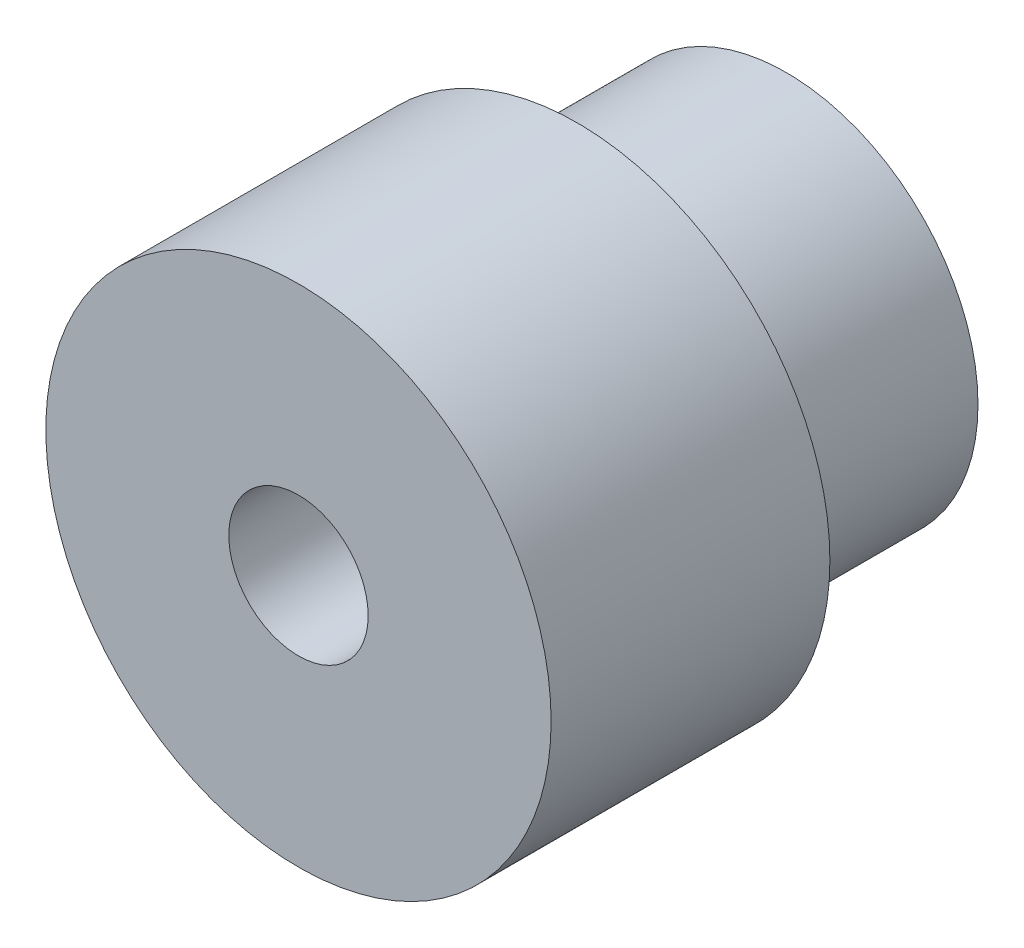
ISO-10303-21;
HEADER;
FILE_DESCRIPTION(('STEP AP214'),'2;1');
FILE_NAME('part.step','',(''),(''),'','','');
FILE_SCHEMA(('AUTOMOTIVE_DESIGN { 1 0 10303 214 1 1 1 1 }'));
ENDSEC;
DATA;
#1=APPLICATION_CONTEXT('core data for automotive mechanical design processes');
#2=APPLICATION_PROTOCOL_DEFINITION('international standard','automotive_design',2000,#1);
#3=PRODUCT_CONTEXT('',#1,'mechanical');
#4=PRODUCT('Part','Part','',(#3));
#5=PRODUCT_RELATED_PRODUCT_CATEGORY('part','',(#4));
#6=PRODUCT_DEFINITION_FORMATION('','',#4);
#7=PRODUCT_DEFINITION_CONTEXT('part definition',#1,'design');
#8=PRODUCT_DEFINITION('design','',#6,#7);
#9=PRODUCT_DEFINITION_SHAPE('','',#8);
#10=(LENGTH_UNIT() NAMED_UNIT(*) SI_UNIT(.MILLI.,.METRE.));
#11=(NAMED_UNIT(*) PLANE_ANGLE_UNIT() SI_UNIT($,.RADIAN.));
#12=(NAMED_UNIT(*) SI_UNIT($,.STERADIAN.) SOLID_ANGLE_UNIT());
#13=UNCERTAINTY_MEASURE_WITH_UNIT(LENGTH_MEASURE(1.E-05),#10,'distance_accuracy_value','');
#14=(GEOMETRIC_REPRESENTATION_CONTEXT(3) GLOBAL_UNCERTAINTY_ASSIGNED_CONTEXT((#13)) GLOBAL_UNIT_ASSIGNED_CONTEXT((#10,
#11,#12)) REPRESENTATION_CONTEXT('',''));
#15=CARTESIAN_POINT('',(0.,0.,0.));
#16=DIRECTION('',(0.,0.,1.));
#17=DIRECTION('',(1.,0.,0.));
#18=AXIS2_PLACEMENT_3D('',#15,#16,#17);
#19=CARTESIAN_POINT('',(0.,0.,16.));
#20=DIRECTION('',(0.,0.,-1.));
#21=DIRECTION('',(-1.,0.,0.));
#22=AXIS2_PLACEMENT_3D('',#19,#20,#21);
#23=CYLINDRICAL_SURFACE('',#22,14.5);
#24=CARTESIAN_POINT('',(0.,0.,16.));
#25=DIRECTION('',(0.,0.,1.));
#26=DIRECTION('',(1.,0.,0.));
#27=AXIS2_PLACEMENT_3D('',#24,#25,#26);
#28=CIRCLE('',#27,14.5);
#29=CARTESIAN_POINT('',(14.5,0.,16.));
#30=VERTEX_POINT('',#29);
#31=EDGE_CURVE('E10',#30,#30,#28,.T.);
#32=ORIENTED_EDGE('',*,*,#31,.F.);
#33=EDGE_LOOP('',(#32));
#34=FACE_BOUND('',#33,.T.);
#35=CARTESIAN_POINT('',(0.,0.,0.));
#36=DIRECTION('',(0.,0.,1.));
#37=DIRECTION('',(1.,0.,0.));
#38=AXIS2_PLACEMENT_3D('',#35,#36,#37);
#39=CIRCLE('',#38,14.5);
#40=CARTESIAN_POINT('',(14.5,0.,0.));
#41=VERTEX_POINT('',#40);
#42=EDGE_CURVE('E33',#41,#41,#39,.T.);
#43=ORIENTED_EDGE('',*,*,#42,.T.);
#44=EDGE_LOOP('',(#43));
#45=FACE_BOUND('',#44,.T.);
#46=ADVANCED_FACE('F30',(#34,#45),#23,.T.);
#47=CARTESIAN_POINT('',(0.,0.,16.));
#48=DIRECTION('',(0.,0.,1.));
#49=DIRECTION('',(1.,0.,0.));
#50=AXIS2_PLACEMENT_3D('',#47,#48,#49);
#51=PLANE('',#50);
#52=CARTESIAN_POINT('',(0.,0.,16.));
#53=DIRECTION('',(0.,0.,1.));
#54=DIRECTION('',(1.,0.,0.));
#55=AXIS2_PLACEMENT_3D('',#52,#53,#54);
#56=CIRCLE('',#55,4.);
#57=CARTESIAN_POINT('',(4.,0.,16.));
#58=VERTEX_POINT('',#57);
#59=EDGE_CURVE('E50',#58,#58,#56,.T.);
#60=ORIENTED_EDGE('',*,*,#59,.F.);
#61=EDGE_LOOP('',(#60));
#62=FACE_BOUND('',#61,.T.);
#63=ORIENTED_EDGE('',*,*,#31,.T.);
#64=EDGE_LOOP('',(#63));
#65=FACE_BOUND('',#64,.T.);
#66=ADVANCED_FACE('F56',(#62,#65),#51,.T.);
#67=CARTESIAN_POINT('',(0.,0.,0.));
#68=DIRECTION('',(0.,0.,1.));
#69=DIRECTION('',(1.,0.,0.));
#70=AXIS2_PLACEMENT_3D('',#67,#68,#69);
#71=PLANE('',#70);
#72=CARTESIAN_POINT('',(0.,0.,0.));
#73=DIRECTION('',(0.,0.,1.));
#74=DIRECTION('',(1.,0.,0.));
#75=AXIS2_PLACEMENT_3D('',#72,#73,#74);
#76=CIRCLE('',#75,11.);
#77=CARTESIAN_POINT('',(11.,0.,0.));
#78=VERTEX_POINT('',#77);
#79=EDGE_CURVE('E42',#78,#78,#76,.T.);
#80=ORIENTED_EDGE('',*,*,#79,.T.);
#81=EDGE_LOOP('',(#80));
#82=FACE_BOUND('',#81,.T.);
#83=ORIENTED_EDGE('',*,*,#42,.F.);
#84=EDGE_LOOP('',(#83));
#85=FACE_BOUND('',#84,.T.);
#86=ADVANCED_FACE('F58',(#82,#85),#71,.F.);
#87=CARTESIAN_POINT('',(0.,0.,-12.));
#88=DIRECTION('',(0.,0.,1.));
#89=DIRECTION('',(1.,0.,0.));
#90=AXIS2_PLACEMENT_3D('',#87,#88,#89);
#91=CYLINDRICAL_SURFACE('',#90,11.);
#92=CARTESIAN_POINT('',(0.,0.,-12.));
#93=DIRECTION('',(0.,0.,1.));
#94=DIRECTION('',(1.,0.,0.));
#95=AXIS2_PLACEMENT_3D('',#92,#93,#94);
#96=CIRCLE('',#95,11.);
#97=CARTESIAN_POINT('',(11.,0.,-12.));
#98=VERTEX_POINT('',#97);
#99=EDGE_CURVE('E40',#98,#98,#96,.T.);
#100=ORIENTED_EDGE('',*,*,#99,.T.);
#101=EDGE_LOOP('',(#100));
#102=FACE_BOUND('',#101,.T.);
#103=ORIENTED_EDGE('',*,*,#79,.F.);
#104=EDGE_LOOP('',(#103));
#105=FACE_BOUND('',#104,.T.);
#106=ADVANCED_FACE('F64',(#102,#105),#91,.T.);
#107=CARTESIAN_POINT('',(0.,0.,-12.));
#108=DIRECTION('',(0.,0.,1.));
#109=DIRECTION('',(1.,0.,0.));
#110=AXIS2_PLACEMENT_3D('',#107,#108,#109);
#111=PLANE('',#110);
#112=CARTESIAN_POINT('',(0.,0.,-12.));
#113=DIRECTION('',(0.,0.,1.));
#114=DIRECTION('',(1.,0.,0.));
#115=AXIS2_PLACEMENT_3D('',#112,#113,#114);
#116=CIRCLE('',#115,4.);
#117=CARTESIAN_POINT('',(4.,0.,-12.));
#118=VERTEX_POINT('',#117);
#119=EDGE_CURVE('E45',#118,#118,#116,.T.);
#120=ORIENTED_EDGE('',*,*,#119,.T.);
#121=EDGE_LOOP('',(#120));
#122=FACE_BOUND('',#121,.T.);
#123=ORIENTED_EDGE('',*,*,#99,.F.);
#124=EDGE_LOOP('',(#123));
#125=FACE_BOUND('',#124,.T.);
#126=ADVANCED_FACE('F70',(#122,#125),#111,.F.);
#127=CARTESIAN_POINT('',(0.,0.,-12.));
#128=DIRECTION('',(0.,0.,1.));
#129=DIRECTION('',(1.,0.,0.));
#130=AXIS2_PLACEMENT_3D('',#127,#128,#129);
#131=CYLINDRICAL_SURFACE('',#130,4.);
#132=ORIENTED_EDGE('',*,*,#119,.F.);
#133=EDGE_LOOP('',(#132));
#134=FACE_BOUND('',#133,.T.);
#135=ORIENTED_EDGE('',*,*,#59,.T.);
#136=EDGE_LOOP('',(#135));
#137=FACE_BOUND('',#136,.T.);
#138=ADVANCED_FACE('F54',(#134,#137),#131,.F.);
#139=CLOSED_SHELL('',(#46,#66,#86,#106,#126,#138));
#140=MANIFOLD_SOLID_BREP('B2',#139);
#141=ADVANCED_BREP_SHAPE_REPRESENTATION('',(#18,#140),#14);
#142=SHAPE_DEFINITION_REPRESENTATION(#9,#141);
ENDSEC;
END-ISO-10303-21;
